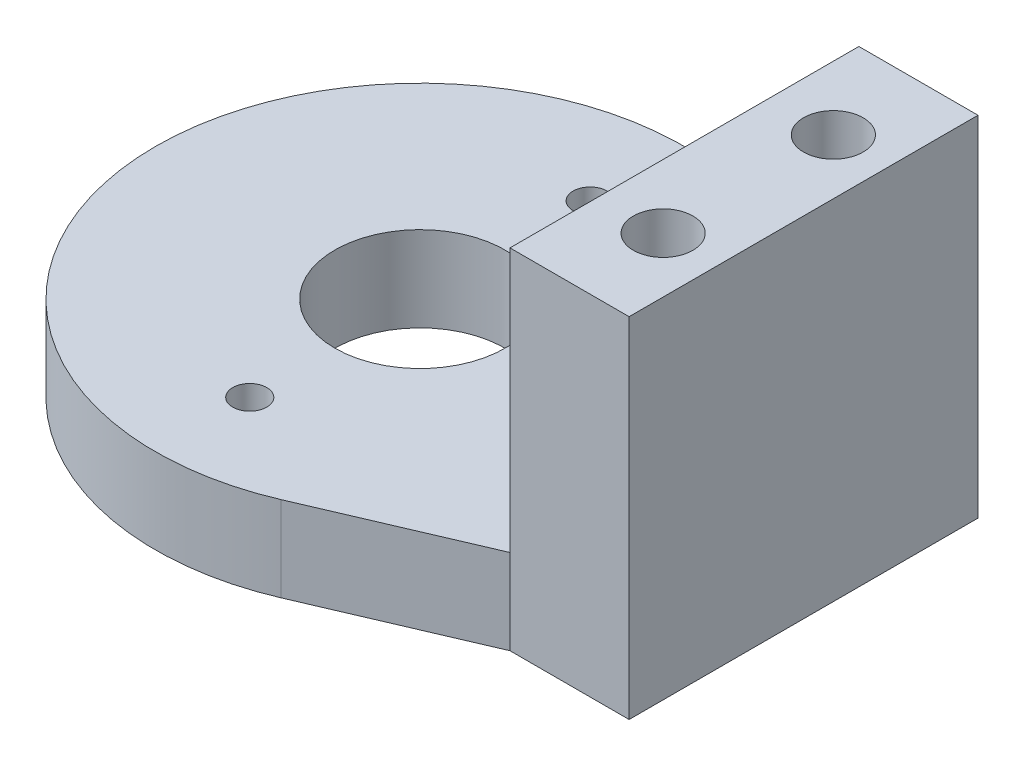
ISO-10303-21;
HEADER;
FILE_DESCRIPTION(('STEP AP214'),'2;1');
FILE_NAME('part.step','',(''),(''),'','','');
FILE_SCHEMA(('AUTOMOTIVE_DESIGN { 1 0 10303 214 1 1 1 1 }'));
ENDSEC;
DATA;
#1=APPLICATION_CONTEXT('core data for automotive mechanical design processes');
#2=APPLICATION_PROTOCOL_DEFINITION('international standard','automotive_design',2000,#1);
#3=PRODUCT_CONTEXT('',#1,'mechanical');
#4=PRODUCT('Part','Part','',(#3));
#5=PRODUCT_RELATED_PRODUCT_CATEGORY('part','',(#4));
#6=PRODUCT_DEFINITION_FORMATION('','',#4);
#7=PRODUCT_DEFINITION_CONTEXT('part definition',#1,'design');
#8=PRODUCT_DEFINITION('design','',#6,#7);
#9=PRODUCT_DEFINITION_SHAPE('','',#8);
#10=(LENGTH_UNIT() NAMED_UNIT(*) SI_UNIT(.MILLI.,.METRE.));
#11=(NAMED_UNIT(*) PLANE_ANGLE_UNIT() SI_UNIT($,.RADIAN.));
#12=(NAMED_UNIT(*) SI_UNIT($,.STERADIAN.) SOLID_ANGLE_UNIT());
#13=UNCERTAINTY_MEASURE_WITH_UNIT(LENGTH_MEASURE(1.E-05),#10,'distance_accuracy_value','');
#14=(GEOMETRIC_REPRESENTATION_CONTEXT(3) GLOBAL_UNCERTAINTY_ASSIGNED_CONTEXT((#13)) GLOBAL_UNIT_ASSIGNED_CONTEXT((#10,
#11,#12)) REPRESENTATION_CONTEXT('',''));
#15=CARTESIAN_POINT('',(0.,0.,0.));
#16=DIRECTION('',(0.,0.,1.));
#17=DIRECTION('',(1.,0.,0.));
#18=AXIS2_PLACEMENT_3D('',#15,#16,#17);
#19=CARTESIAN_POINT('',(0.,20.50030868,0.));
#20=DIRECTION('',(1.,0.,0.));
#21=DIRECTION('',(0.,0.,-1.));
#22=AXIS2_PLACEMENT_3D('',#19,#20,#21);
#23=PLANE('',#22);
#24=DIRECTION('',(0.,0.,-1.));
#25=VECTOR('',#24,1.);
#26=CARTESIAN_POINT('',(0.,5.,0.));
#27=LINE('',#26,#25);
#28=CARTESIAN_POINT('',(0.,5.,20.5));
#29=VERTEX_POINT('',#28);
#30=CARTESIAN_POINT('',(0.,5.,0.));
#31=VERTEX_POINT('',#30);
#32=EDGE_CURVE('E54',#29,#31,#27,.T.);
#33=ORIENTED_EDGE('',*,*,#32,.F.);
#34=DIRECTION('',(0.,-1.,0.));
#35=VECTOR('',#34,1.);
#36=CARTESIAN_POINT('',(0.,20.50030868,20.5));
#37=LINE('',#36,#35);
#38=CARTESIAN_POINT('',(0.,20.50030868,20.5));
#39=VERTEX_POINT('',#38);
#40=EDGE_CURVE('E11',#39,#29,#37,.T.);
#41=ORIENTED_EDGE('',*,*,#40,.F.);
#42=DIRECTION('',(0.,0.,1.));
#43=VECTOR('',#42,1.);
#44=CARTESIAN_POINT('',(0.,20.50030868,0.));
#45=LINE('',#44,#43);
#46=CARTESIAN_POINT('',(0.,20.50030868,0.));
#47=VERTEX_POINT('',#46);
#48=EDGE_CURVE('E107',#47,#39,#45,.T.);
#49=ORIENTED_EDGE('',*,*,#48,.F.);
#50=DIRECTION('',(0.,-1.,0.));
#51=VECTOR('',#50,1.);
#52=CARTESIAN_POINT('',(0.,20.50030868,0.));
#53=LINE('',#52,#51);
#54=EDGE_CURVE('E106',#47,#31,#53,.T.);
#55=ORIENTED_EDGE('',*,*,#54,.T.);
#56=EDGE_LOOP('',(#33,#41,#49,#55));
#57=FACE_BOUND('',#56,.T.);
#58=ADVANCED_FACE('F39',(#57),#23,.F.);
#59=CARTESIAN_POINT('',(0.,20.50030868,20.5));
#60=DIRECTION('',(0.,0.,-1.));
#61=DIRECTION('',(-1.,0.,0.));
#62=AXIS2_PLACEMENT_3D('',#59,#60,#61);
#63=PLANE('',#62);
#64=DIRECTION('',(1.,0.,0.));
#65=VECTOR('',#64,1.);
#66=CARTESIAN_POINT('',(0.,0.,20.5));
#67=LINE('',#66,#65);
#68=CARTESIAN_POINT('',(0.,0.,20.5));
#69=VERTEX_POINT('',#68);
#70=CARTESIAN_POINT('',(7.,0.,20.5));
#71=VERTEX_POINT('',#70);
#72=EDGE_CURVE('E168',#69,#71,#67,.T.);
#73=ORIENTED_EDGE('',*,*,#72,.T.);
#74=DIRECTION('',(0.,-1.,0.));
#75=VECTOR('',#74,1.);
#76=CARTESIAN_POINT('',(7.,20.50030868,20.5));
#77=LINE('',#76,#75);
#78=CARTESIAN_POINT('',(7.,20.50030868,20.5));
#79=VERTEX_POINT('',#78);
#80=EDGE_CURVE('E47',#79,#71,#77,.T.);
#81=ORIENTED_EDGE('',*,*,#80,.F.);
#82=DIRECTION('',(1.,0.,0.));
#83=VECTOR('',#82,1.);
#84=CARTESIAN_POINT('',(0.,20.50030868,20.5));
#85=LINE('',#84,#83);
#86=EDGE_CURVE('E91',#39,#79,#85,.T.);
#87=ORIENTED_EDGE('',*,*,#86,.F.);
#88=ORIENTED_EDGE('',*,*,#40,.T.);
#89=DIRECTION('',(0.,-1.,0.));
#90=VECTOR('',#89,1.);
#91=CARTESIAN_POINT('',(0.,5.,20.5));
#92=LINE('',#91,#90);
#93=EDGE_CURVE('E149',#29,#69,#92,.T.);
#94=ORIENTED_EDGE('',*,*,#93,.T.);
#95=EDGE_LOOP('',(#73,#81,#87,#88,#94));
#96=FACE_BOUND('',#95,.T.);
#97=ADVANCED_FACE('F214',(#96),#63,.F.);
#98=CARTESIAN_POINT('',(7.,20.50030868,0.));
#99=DIRECTION('',(-1.,0.,0.));
#100=DIRECTION('',(0.,0.,1.));
#101=AXIS2_PLACEMENT_3D('',#98,#99,#100);
#102=PLANE('',#101);
#103=DIRECTION('',(0.,0.,-1.));
#104=VECTOR('',#103,1.);
#105=CARTESIAN_POINT('',(7.,0.,0.));
#106=LINE('',#105,#104);
#107=CARTESIAN_POINT('',(7.,0.,0.));
#108=VERTEX_POINT('',#107);
#109=EDGE_CURVE('E191',#71,#108,#106,.T.);
#110=ORIENTED_EDGE('',*,*,#109,.T.);
#111=DIRECTION('',(0.,-1.,0.));
#112=VECTOR('',#111,1.);
#113=CARTESIAN_POINT('',(7.,20.50030868,0.));
#114=LINE('',#113,#112);
#115=CARTESIAN_POINT('',(7.,20.50030868,0.));
#116=VERTEX_POINT('',#115);
#117=EDGE_CURVE('E109',#116,#108,#114,.T.);
#118=ORIENTED_EDGE('',*,*,#117,.F.);
#119=DIRECTION('',(0.,0.,-1.));
#120=VECTOR('',#119,1.);
#121=CARTESIAN_POINT('',(7.,20.50030868,0.));
#122=LINE('',#121,#120);
#123=EDGE_CURVE('E184',#79,#116,#122,.T.);
#124=ORIENTED_EDGE('',*,*,#123,.F.);
#125=ORIENTED_EDGE('',*,*,#80,.T.);
#126=EDGE_LOOP('',(#110,#118,#124,#125));
#127=FACE_BOUND('',#126,.T.);
#128=ADVANCED_FACE('F202',(#127),#102,.F.);
#129=CARTESIAN_POINT('',(0.,20.50030868,0.));
#130=DIRECTION('',(0.,0.,1.));
#131=DIRECTION('',(1.,0.,0.));
#132=AXIS2_PLACEMENT_3D('',#129,#130,#131);
#133=PLANE('',#132);
#134=DIRECTION('',(-1.,0.,0.));
#135=VECTOR('',#134,1.);
#136=CARTESIAN_POINT('',(0.,0.,0.));
#137=LINE('',#136,#135);
#138=CARTESIAN_POINT('',(0.,0.,0.));
#139=VERTEX_POINT('',#138);
#140=EDGE_CURVE('E84',#108,#139,#137,.T.);
#141=ORIENTED_EDGE('',*,*,#140,.T.);
#142=DIRECTION('',(0.,-1.,0.));
#143=VECTOR('',#142,1.);
#144=CARTESIAN_POINT('',(0.,5.,0.));
#145=LINE('',#144,#143);
#146=EDGE_CURVE('E112',#31,#139,#145,.T.);
#147=ORIENTED_EDGE('',*,*,#146,.F.);
#148=ORIENTED_EDGE('',*,*,#54,.F.);
#149=DIRECTION('',(-1.,0.,0.));
#150=VECTOR('',#149,1.);
#151=CARTESIAN_POINT('',(0.,20.50030868,0.));
#152=LINE('',#151,#150);
#153=EDGE_CURVE('E62',#116,#47,#152,.T.);
#154=ORIENTED_EDGE('',*,*,#153,.F.);
#155=ORIENTED_EDGE('',*,*,#117,.T.);
#156=EDGE_LOOP('',(#141,#147,#148,#154,#155));
#157=FACE_BOUND('',#156,.T.);
#158=ADVANCED_FACE('F114',(#157),#133,.F.);
#159=CARTESIAN_POINT('',(0.,20.50030868,0.));
#160=DIRECTION('',(0.,1.,0.));
#161=DIRECTION('',(0.,0.,1.));
#162=AXIS2_PLACEMENT_3D('',#159,#160,#161);
#163=PLANE('',#162);
#164=CARTESIAN_POINT('',(3.75,20.50030868,5.25));
#165=DIRECTION('',(0.,1.,0.));
#166=DIRECTION('',(0.,0.,1.));
#167=AXIS2_PLACEMENT_3D('',#164,#165,#166);
#168=CIRCLE('',#167,1.75);
#169=CARTESIAN_POINT('',(3.75,20.50030868,7.));
#170=VERTEX_POINT('',#169);
#171=EDGE_CURVE('E169',#170,#170,#168,.T.);
#172=ORIENTED_EDGE('',*,*,#171,.F.);
#173=EDGE_LOOP('',(#172));
#174=FACE_BOUND('',#173,.T.);
#175=CARTESIAN_POINT('',(3.75,20.50030868,15.25));
#176=DIRECTION('',(0.,1.,0.));
#177=DIRECTION('',(0.,0.,-1.));
#178=AXIS2_PLACEMENT_3D('',#175,#176,#177);
#179=CIRCLE('',#178,1.75);
#180=CARTESIAN_POINT('',(3.75,20.50030868,13.5));
#181=VERTEX_POINT('',#180);
#182=EDGE_CURVE('E117',#181,#181,#179,.T.);
#183=ORIENTED_EDGE('',*,*,#182,.F.);
#184=EDGE_LOOP('',(#183));
#185=FACE_BOUND('',#184,.T.);
#186=ORIENTED_EDGE('',*,*,#48,.T.);
#187=ORIENTED_EDGE('',*,*,#86,.T.);
#188=ORIENTED_EDGE('',*,*,#123,.T.);
#189=ORIENTED_EDGE('',*,*,#153,.T.);
#190=EDGE_LOOP('',(#186,#187,#188,#189));
#191=FACE_BOUND('',#190,.T.);
#192=ADVANCED_FACE('F224',(#174,#185,#191),#163,.T.);
#193=CARTESIAN_POINT('',(0.,0.,0.));
#194=DIRECTION('',(0.,1.,0.));
#195=DIRECTION('',(0.,0.,1.));
#196=AXIS2_PLACEMENT_3D('',#193,#194,#195);
#197=PLANE('',#196);
#198=CARTESIAN_POINT('',(-15.53982623,0.,0.25));
#199=DIRECTION('',(0.,1.,0.));
#200=DIRECTION('',(0.,0.,1.));
#201=AXIS2_PLACEMENT_3D('',#198,#199,#200);
#202=CIRCLE('',#201,1.);
#203=CARTESIAN_POINT('',(-15.53982623,0.,1.25));
#204=VERTEX_POINT('',#203);
#205=EDGE_CURVE('E153',#204,#204,#202,.T.);
#206=ORIENTED_EDGE('',*,*,#205,.T.);
#207=EDGE_LOOP('',(#206));
#208=FACE_BOUND('',#207,.T.);
#209=CARTESIAN_POINT('',(-15.53982623,0.,20.25));
#210=DIRECTION('',(0.,1.,0.));
#211=DIRECTION('',(0.,0.,-1.));
#212=AXIS2_PLACEMENT_3D('',#209,#210,#211);
#213=CIRCLE('',#212,1.);
#214=CARTESIAN_POINT('',(-15.53982623,0.,19.25));
#215=VERTEX_POINT('',#214);
#216=EDGE_CURVE('E268',#215,#215,#213,.T.);
#217=ORIENTED_EDGE('',*,*,#216,.T.);
#218=EDGE_LOOP('',(#217));
#219=FACE_BOUND('',#218,.T.);
#220=CARTESIAN_POINT('',(-15.53982623,0.,10.25));
#221=DIRECTION('',(0.,1.,0.));
#222=DIRECTION('',(0.,0.,1.));
#223=AXIS2_PLACEMENT_3D('',#220,#221,#222);
#224=CIRCLE('',#223,5.);
#225=CARTESIAN_POINT('',(-15.53982623,0.,15.25));
#226=VERTEX_POINT('',#225);
#227=EDGE_CURVE('E279',#226,#226,#224,.T.);
#228=ORIENTED_EDGE('',*,*,#227,.T.);
#229=EDGE_LOOP('',(#228));
#230=FACE_BOUND('',#229,.T.);
#231=CARTESIAN_POINT('',(3.75,0.,5.25));
#232=DIRECTION('',(0.,1.,0.));
#233=DIRECTION('',(0.,0.,1.));
#234=AXIS2_PLACEMENT_3D('',#231,#232,#233);
#235=CIRCLE('',#234,1.75);
#236=CARTESIAN_POINT('',(3.75,0.,7.));
#237=VERTEX_POINT('',#236);
#238=EDGE_CURVE('E164',#237,#237,#235,.T.);
#239=ORIENTED_EDGE('',*,*,#238,.T.);
#240=EDGE_LOOP('',(#239));
#241=FACE_BOUND('',#240,.T.);
#242=CARTESIAN_POINT('',(3.75,0.,15.25));
#243=DIRECTION('',(0.,1.,0.));
#244=DIRECTION('',(0.,0.,-1.));
#245=AXIS2_PLACEMENT_3D('',#242,#243,#244);
#246=CIRCLE('',#245,1.75);
#247=CARTESIAN_POINT('',(3.75,0.,13.5));
#248=VERTEX_POINT('',#247);
#249=EDGE_CURVE('E173',#248,#248,#246,.T.);
#250=ORIENTED_EDGE('',*,*,#249,.T.);
#251=EDGE_LOOP('',(#250));
#252=FACE_BOUND('',#251,.T.);
#253=ORIENTED_EDGE('',*,*,#72,.F.);
#254=DIRECTION('',(0.91925446090705,0.,-0.393663861819305));
#255=VECTOR('',#254,1.);
#256=CARTESIAN_POINT('',(0.,0.,20.5));
#257=LINE('',#256,#255);
#258=CARTESIAN_POINT('',(-9.42235822429726,0.,24.5350545836479));
#259=VERTEX_POINT('',#258);
#260=EDGE_CURVE('E135',#259,#69,#257,.T.);
#261=ORIENTED_EDGE('',*,*,#260,.F.);
#262=CARTESIAN_POINT('',(-15.53982623,0.,10.25));
#263=DIRECTION('',(0.,1.,0.));
#264=DIRECTION('',(0.,0.,1.));
#265=AXIS2_PLACEMENT_3D('',#262,#263,#264);
#266=CIRCLE('',#265,15.53982623);
#267=CARTESIAN_POINT('',(-9.42235822429726,0.,-4.03505458364788));
#268=VERTEX_POINT('',#267);
#269=EDGE_CURVE('E139',#268,#259,#266,.T.);
#270=ORIENTED_EDGE('',*,*,#269,.F.);
#271=DIRECTION('',(-0.91925446090705,0.,-0.393663861819306));
#272=VECTOR('',#271,1.);
#273=CARTESIAN_POINT('',(0.,0.,0.));
#274=LINE('',#273,#272);
#275=EDGE_CURVE('E150',#139,#268,#274,.T.);
#276=ORIENTED_EDGE('',*,*,#275,.F.);
#277=ORIENTED_EDGE('',*,*,#140,.F.);
#278=ORIENTED_EDGE('',*,*,#109,.F.);
#279=EDGE_LOOP('',(#253,#261,#270,#276,#277,#278));
#280=FACE_BOUND('',#279,.T.);
#281=ADVANCED_FACE('F206',(#208,#219,#230,#241,#252,#280),#197,.F.);
#282=CARTESIAN_POINT('',(3.75,0.,15.25));
#283=DIRECTION('',(0.,1.,0.));
#284=DIRECTION('',(0.,0.,1.));
#285=AXIS2_PLACEMENT_3D('',#282,#283,#284);
#286=CYLINDRICAL_SURFACE('',#285,1.75);
#287=ORIENTED_EDGE('',*,*,#249,.F.);
#288=EDGE_LOOP('',(#287));
#289=FACE_BOUND('',#288,.T.);
#290=ORIENTED_EDGE('',*,*,#182,.T.);
#291=EDGE_LOOP('',(#290));
#292=FACE_BOUND('',#291,.T.);
#293=ADVANCED_FACE('F227',(#289,#292),#286,.F.);
#294=CARTESIAN_POINT('',(3.75,0.,5.25));
#295=DIRECTION('',(0.,1.,0.));
#296=DIRECTION('',(0.,0.,1.));
#297=AXIS2_PLACEMENT_3D('',#294,#295,#296);
#298=CYLINDRICAL_SURFACE('',#297,1.75);
#299=ORIENTED_EDGE('',*,*,#238,.F.);
#300=EDGE_LOOP('',(#299));
#301=FACE_BOUND('',#300,.T.);
#302=ORIENTED_EDGE('',*,*,#171,.T.);
#303=EDGE_LOOP('',(#302));
#304=FACE_BOUND('',#303,.T.);
#305=ADVANCED_FACE('F234',(#301,#304),#298,.F.);
#306=CARTESIAN_POINT('',(0.,5.,0.));
#307=DIRECTION('',(-0.393663861819306,0.,0.91925446090705));
#308=DIRECTION('',(0.91925446090705,0.,0.393663861819306));
#309=AXIS2_PLACEMENT_3D('',#306,#307,#308);
#310=PLANE('',#309);
#311=ORIENTED_EDGE('',*,*,#275,.T.);
#312=DIRECTION('',(0.,-1.,0.));
#313=VECTOR('',#312,1.);
#314=CARTESIAN_POINT('',(-9.42235822429726,5.,-4.03505458364788));
#315=LINE('',#314,#313);
#316=CARTESIAN_POINT('',(-9.42235822429726,5.,-4.03505458364788));
#317=VERTEX_POINT('',#316);
#318=EDGE_CURVE('E118',#317,#268,#315,.T.);
#319=ORIENTED_EDGE('',*,*,#318,.F.);
#320=DIRECTION('',(-0.91925446090705,0.,-0.393663861819306));
#321=VECTOR('',#320,1.);
#322=CARTESIAN_POINT('',(0.,5.,0.));
#323=LINE('',#322,#321);
#324=EDGE_CURVE('E121',#31,#317,#323,.T.);
#325=ORIENTED_EDGE('',*,*,#324,.F.);
#326=ORIENTED_EDGE('',*,*,#146,.T.);
#327=EDGE_LOOP('',(#311,#319,#325,#326));
#328=FACE_BOUND('',#327,.T.);
#329=ADVANCED_FACE('F122',(#328),#310,.F.);
#330=CARTESIAN_POINT('',(-15.53982623,5.,10.25));
#331=DIRECTION('',(0.,-1.,0.));
#332=DIRECTION('',(0.,0.,-1.));
#333=AXIS2_PLACEMENT_3D('',#330,#331,#332);
#334=CYLINDRICAL_SURFACE('',#333,15.53982623);
#335=ORIENTED_EDGE('',*,*,#269,.T.);
#336=DIRECTION('',(0.,-1.,0.));
#337=VECTOR('',#336,1.);
#338=CARTESIAN_POINT('',(-9.42235822429726,5.,24.5350545836479));
#339=LINE('',#338,#337);
#340=CARTESIAN_POINT('',(-9.42235822429726,5.,24.5350545836479));
#341=VERTEX_POINT('',#340);
#342=EDGE_CURVE('E158',#341,#259,#339,.T.);
#343=ORIENTED_EDGE('',*,*,#342,.F.);
#344=CARTESIAN_POINT('',(-15.53982623,5.,10.25));
#345=DIRECTION('',(0.,1.,0.));
#346=DIRECTION('',(0.,0.,1.));
#347=AXIS2_PLACEMENT_3D('',#344,#345,#346);
#348=CIRCLE('',#347,15.53982623);
#349=EDGE_CURVE('E127',#317,#341,#348,.T.);
#350=ORIENTED_EDGE('',*,*,#349,.F.);
#351=ORIENTED_EDGE('',*,*,#318,.T.);
#352=EDGE_LOOP('',(#335,#343,#350,#351));
#353=FACE_BOUND('',#352,.T.);
#354=ADVANCED_FACE('F210',(#353),#334,.T.);
#355=CARTESIAN_POINT('',(0.,5.,20.5));
#356=DIRECTION('',(-0.393663861819306,0.,-0.91925446090705));
#357=DIRECTION('',(-0.91925446090705,0.,0.393663861819306));
#358=AXIS2_PLACEMENT_3D('',#355,#356,#357);
#359=PLANE('',#358);
#360=ORIENTED_EDGE('',*,*,#260,.T.);
#361=ORIENTED_EDGE('',*,*,#93,.F.);
#362=DIRECTION('',(0.91925446090705,0.,-0.393663861819305));
#363=VECTOR('',#362,1.);
#364=CARTESIAN_POINT('',(0.,5.,20.5));
#365=LINE('',#364,#363);
#366=EDGE_CURVE('E132',#341,#29,#365,.T.);
#367=ORIENTED_EDGE('',*,*,#366,.F.);
#368=ORIENTED_EDGE('',*,*,#342,.T.);
#369=EDGE_LOOP('',(#360,#361,#367,#368));
#370=FACE_BOUND('',#369,.T.);
#371=ADVANCED_FACE('F213',(#370),#359,.F.);
#372=CARTESIAN_POINT('',(-15.53982623,5.,10.25));
#373=DIRECTION('',(0.,1.,0.));
#374=DIRECTION('',(0.,0.,1.));
#375=AXIS2_PLACEMENT_3D('',#372,#373,#374);
#376=PLANE('',#375);
#377=CARTESIAN_POINT('',(-15.53982623,5.,0.25));
#378=DIRECTION('',(0.,1.,0.));
#379=DIRECTION('',(0.,0.,1.));
#380=AXIS2_PLACEMENT_3D('',#377,#378,#379);
#381=CIRCLE('',#380,1.);
#382=CARTESIAN_POINT('',(-15.53982623,5.,1.25));
#383=VERTEX_POINT('',#382);
#384=EDGE_CURVE('E266',#383,#383,#381,.T.);
#385=ORIENTED_EDGE('',*,*,#384,.F.);
#386=EDGE_LOOP('',(#385));
#387=FACE_BOUND('',#386,.T.);
#388=CARTESIAN_POINT('',(-15.53982623,5.,20.25));
#389=DIRECTION('',(0.,1.,0.));
#390=DIRECTION('',(0.,0.,-1.));
#391=AXIS2_PLACEMENT_3D('',#388,#389,#390);
#392=CIRCLE('',#391,1.);
#393=CARTESIAN_POINT('',(-15.53982623,5.,19.25));
#394=VERTEX_POINT('',#393);
#395=EDGE_CURVE('E274',#394,#394,#392,.T.);
#396=ORIENTED_EDGE('',*,*,#395,.F.);
#397=EDGE_LOOP('',(#396));
#398=FACE_BOUND('',#397,.T.);
#399=CARTESIAN_POINT('',(-15.53982623,5.,10.25));
#400=DIRECTION('',(0.,1.,0.));
#401=DIRECTION('',(0.,0.,1.));
#402=AXIS2_PLACEMENT_3D('',#399,#400,#401);
#403=CIRCLE('',#402,5.);
#404=CARTESIAN_POINT('',(-15.53982623,5.,15.25));
#405=VERTEX_POINT('',#404);
#406=EDGE_CURVE('E142',#405,#405,#403,.T.);
#407=ORIENTED_EDGE('',*,*,#406,.F.);
#408=EDGE_LOOP('',(#407));
#409=FACE_BOUND('',#408,.T.);
#410=ORIENTED_EDGE('',*,*,#32,.T.);
#411=ORIENTED_EDGE('',*,*,#324,.T.);
#412=ORIENTED_EDGE('',*,*,#349,.T.);
#413=ORIENTED_EDGE('',*,*,#366,.T.);
#414=EDGE_LOOP('',(#410,#411,#412,#413));
#415=FACE_BOUND('',#414,.T.);
#416=ADVANCED_FACE('F130',(#387,#398,#409,#415),#376,.T.);
#417=CARTESIAN_POINT('',(-15.53982623,0.,10.25));
#418=DIRECTION('',(0.,1.,0.));
#419=DIRECTION('',(0.,0.,1.));
#420=AXIS2_PLACEMENT_3D('',#417,#418,#419);
#421=CYLINDRICAL_SURFACE('',#420,5.);
#422=ORIENTED_EDGE('',*,*,#227,.F.);
#423=EDGE_LOOP('',(#422));
#424=FACE_BOUND('',#423,.T.);
#425=ORIENTED_EDGE('',*,*,#406,.T.);
#426=EDGE_LOOP('',(#425));
#427=FACE_BOUND('',#426,.T.);
#428=ADVANCED_FACE('F247',(#424,#427),#421,.F.);
#429=CARTESIAN_POINT('',(-15.53982623,0.,20.25));
#430=DIRECTION('',(0.,1.,0.));
#431=DIRECTION('',(0.,0.,1.));
#432=AXIS2_PLACEMENT_3D('',#429,#430,#431);
#433=CYLINDRICAL_SURFACE('',#432,1.);
#434=ORIENTED_EDGE('',*,*,#216,.F.);
#435=EDGE_LOOP('',(#434));
#436=FACE_BOUND('',#435,.T.);
#437=ORIENTED_EDGE('',*,*,#395,.T.);
#438=EDGE_LOOP('',(#437));
#439=FACE_BOUND('',#438,.T.);
#440=ADVANCED_FACE('F251',(#436,#439),#433,.F.);
#441=CARTESIAN_POINT('',(-15.53982623,0.,0.25));
#442=DIRECTION('',(0.,1.,0.));
#443=DIRECTION('',(0.,0.,1.));
#444=AXIS2_PLACEMENT_3D('',#441,#442,#443);
#445=CYLINDRICAL_SURFACE('',#444,1.);
#446=ORIENTED_EDGE('',*,*,#205,.F.);
#447=EDGE_LOOP('',(#446));
#448=FACE_BOUND('',#447,.T.);
#449=ORIENTED_EDGE('',*,*,#384,.T.);
#450=EDGE_LOOP('',(#449));
#451=FACE_BOUND('',#450,.T.);
#452=ADVANCED_FACE('F255',(#448,#451),#445,.F.);
#453=CLOSED_SHELL('',(#58,#97,#128,#158,#192,#281,#293,#305,#329,#354,#371,#416,#428,#440,#452));
#454=MANIFOLD_SOLID_BREP('B2',#453);
#455=ADVANCED_BREP_SHAPE_REPRESENTATION('',(#18,#454),#14);
#456=SHAPE_DEFINITION_REPRESENTATION(#9,#455);
ENDSEC;
END-ISO-10303-21;
